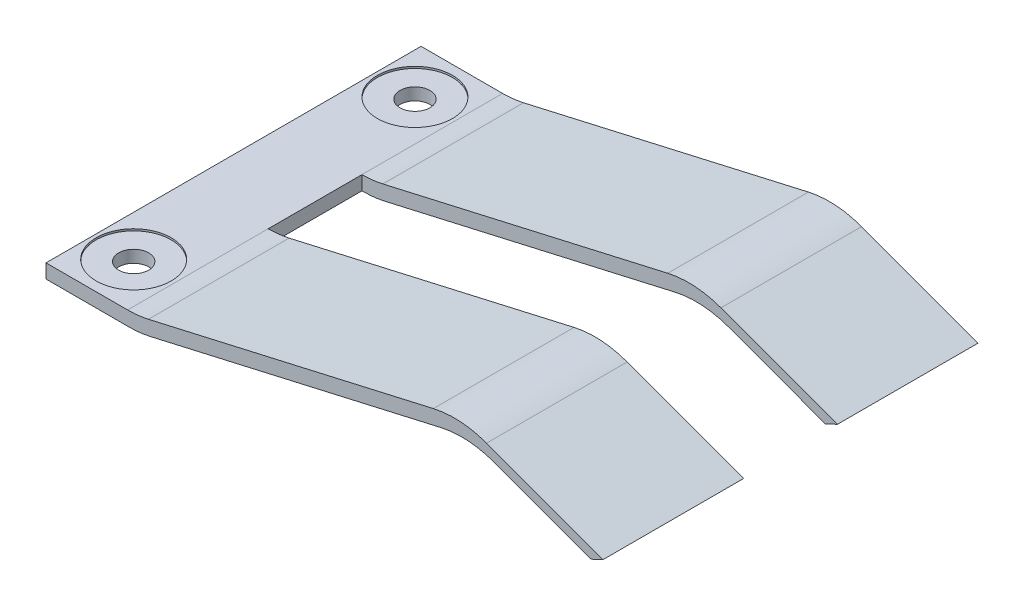
ISO-10303-21;
HEADER;
FILE_DESCRIPTION(('STEP AP214'),'2;1');
FILE_NAME('part.step','',(''),(''),'','','');
FILE_SCHEMA(('AUTOMOTIVE_DESIGN { 1 0 10303 214 1 1 1 1 }'));
ENDSEC;
DATA;
#1=APPLICATION_CONTEXT('core data for automotive mechanical design processes');
#2=APPLICATION_PROTOCOL_DEFINITION('international standard','automotive_design',2000,#1);
#3=PRODUCT_CONTEXT('',#1,'mechanical');
#4=PRODUCT('Part','Part','',(#3));
#5=PRODUCT_RELATED_PRODUCT_CATEGORY('part','',(#4));
#6=PRODUCT_DEFINITION_FORMATION('','',#4);
#7=PRODUCT_DEFINITION_CONTEXT('part definition',#1,'design');
#8=PRODUCT_DEFINITION('design','',#6,#7);
#9=PRODUCT_DEFINITION_SHAPE('','',#8);
#10=(LENGTH_UNIT() NAMED_UNIT(*) SI_UNIT(.MILLI.,.METRE.));
#11=(NAMED_UNIT(*) PLANE_ANGLE_UNIT() SI_UNIT($,.RADIAN.));
#12=(NAMED_UNIT(*) SI_UNIT($,.STERADIAN.) SOLID_ANGLE_UNIT());
#13=UNCERTAINTY_MEASURE_WITH_UNIT(LENGTH_MEASURE(1.E-05),#10,'distance_accuracy_value','');
#14=(GEOMETRIC_REPRESENTATION_CONTEXT(3) GLOBAL_UNCERTAINTY_ASSIGNED_CONTEXT((#13)) GLOBAL_UNIT_ASSIGNED_CONTEXT((#10,
#11,#12)) REPRESENTATION_CONTEXT('',''));
#15=CARTESIAN_POINT('',(0.,0.,0.));
#16=DIRECTION('',(0.,0.,1.));
#17=DIRECTION('',(1.,0.,0.));
#18=AXIS2_PLACEMENT_3D('',#15,#16,#17);
#19=CARTESIAN_POINT('',(0.,0.,40.));
#20=DIRECTION('',(0.,1.,0.));
#21=DIRECTION('',(0.,0.,1.));
#22=AXIS2_PLACEMENT_3D('',#19,#20,#21);
#23=PLANE('',#22);
#24=CARTESIAN_POINT('',(4.35122308541415,0.,35.));
#25=DIRECTION('',(0.,1.,0.));
#26=DIRECTION('',(0.,0.,1.));
#27=AXIS2_PLACEMENT_3D('',#24,#25,#26);
#28=CIRCLE('',#27,1.6);
#29=CARTESIAN_POINT('',(4.35122308541415,0.,36.6));
#30=VERTEX_POINT('',#29);
#31=EDGE_CURVE('E263',#30,#30,#28,.F.);
#32=ORIENTED_EDGE('',*,*,#31,.F.);
#33=EDGE_LOOP('',(#32));
#34=FACE_BOUND('',#33,.T.);
#35=CARTESIAN_POINT('',(4.35122308541415,0.,5.));
#36=DIRECTION('',(0.,1.,0.));
#37=DIRECTION('',(0.,0.,1.));
#38=AXIS2_PLACEMENT_3D('',#35,#36,#37);
#39=CIRCLE('',#38,1.6);
#40=CARTESIAN_POINT('',(4.35122308541415,0.,6.6));
#41=VERTEX_POINT('',#40);
#42=EDGE_CURVE('E281',#41,#41,#39,.F.);
#43=ORIENTED_EDGE('',*,*,#42,.F.);
#44=EDGE_LOOP('',(#43));
#45=FACE_BOUND('',#44,.T.);
#46=DIRECTION('',(1.,0.,0.));
#47=VECTOR('',#46,1.);
#48=CARTESIAN_POINT('',(59.4053783332718,0.,15.));
#49=LINE('',#48,#47);
#50=CARTESIAN_POINT('',(8.7024461708283,0.,15.));
#51=VERTEX_POINT('',#50);
#52=CARTESIAN_POINT('',(8.8716923224594,0.,15.));
#53=VERTEX_POINT('',#52);
#54=EDGE_CURVE('E395',#51,#53,#49,.T.);
#55=ORIENTED_EDGE('',*,*,#54,.F.);
#56=DIRECTION('',(0.,0.,-1.));
#57=VECTOR('',#56,1.);
#58=CARTESIAN_POINT('',(8.7024461708283,0.,15.));
#59=LINE('',#58,#57);
#60=CARTESIAN_POINT('',(8.7024461708283,0.,25.));
#61=VERTEX_POINT('',#60);
#62=EDGE_CURVE('E219',#61,#51,#59,.T.);
#63=ORIENTED_EDGE('',*,*,#62,.F.);
#64=DIRECTION('',(-1.,0.,0.));
#65=VECTOR('',#64,1.);
#66=CARTESIAN_POINT('',(59.4053783332718,0.,25.));
#67=LINE('',#66,#65);
#68=CARTESIAN_POINT('',(8.8716923224594,0.,25.));
#69=VERTEX_POINT('',#68);
#70=EDGE_CURVE('E403',#69,#61,#67,.T.);
#71=ORIENTED_EDGE('',*,*,#70,.F.);
#72=DIRECTION('',(0.,0.,-1.));
#73=VECTOR('',#72,1.);
#74=CARTESIAN_POINT('',(8.8716923224594,0.,40.));
#75=LINE('',#74,#73);
#76=CARTESIAN_POINT('',(8.8716923224594,0.,40.));
#77=VERTEX_POINT('',#76);
#78=EDGE_CURVE('E218',#69,#77,#75,.F.);
#79=ORIENTED_EDGE('',*,*,#78,.T.);
#80=DIRECTION('',(1.,0.,0.));
#81=VECTOR('',#80,1.);
#82=CARTESIAN_POINT('',(0.,0.,40.));
#83=LINE('',#82,#81);
#84=CARTESIAN_POINT('',(0.,0.,40.));
#85=VERTEX_POINT('',#84);
#86=EDGE_CURVE('E290',#85,#77,#83,.T.);
#87=ORIENTED_EDGE('',*,*,#86,.F.);
#88=DIRECTION('',(0.,0.,-1.));
#89=VECTOR('',#88,1.);
#90=CARTESIAN_POINT('',(0.,0.,40.));
#91=LINE('',#90,#89);
#92=CARTESIAN_POINT('',(0.,0.,0.));
#93=VERTEX_POINT('',#92);
#94=EDGE_CURVE('E326',#85,#93,#91,.T.);
#95=ORIENTED_EDGE('',*,*,#94,.T.);
#96=DIRECTION('',(1.,0.,0.));
#97=VECTOR('',#96,1.);
#98=CARTESIAN_POINT('',(0.,0.,0.));
#99=LINE('',#98,#97);
#100=CARTESIAN_POINT('',(8.8716923224594,0.,0.));
#101=VERTEX_POINT('',#100);
#102=EDGE_CURVE('E309',#93,#101,#99,.T.);
#103=ORIENTED_EDGE('',*,*,#102,.T.);
#104=EDGE_CURVE('E235',#101,#53,#75,.F.);
#105=ORIENTED_EDGE('',*,*,#104,.T.);
#106=EDGE_LOOP('',(#55,#63,#71,#79,#87,#95,#103,#105));
#107=FACE_BOUND('',#106,.T.);
#108=ADVANCED_FACE('F42',(#34,#45,#107),#23,.F.);
#109=CARTESIAN_POINT('',(10.,0.,40.));
#110=DIRECTION('',(-0.222824801502141,0.974858506571867,0.));
#111=DIRECTION('',(-0.974858506571867,-0.222824801502141,0.));
#112=AXIS2_PLACEMENT_3D('',#109,#110,#111);
#113=PLANE('',#112);
#114=DIRECTION('',(-0.974858506571867,-0.222824801502141,0.));
#115=VECTOR('',#114,1.);
#116=CARTESIAN_POINT('',(58.8962758151339,11.1762916148877,15.));
#117=LINE('',#116,#115);
#118=CARTESIAN_POINT('',(42.1112913874433,7.33972374570132,15.));
#119=VERTEX_POINT('',#118);
#120=CARTESIAN_POINT('',(11.0999403374808,0.251414934281328,15.));
#121=VERTEX_POINT('',#120);
#122=EDGE_CURVE('E209',#119,#121,#117,.T.);
#123=ORIENTED_EDGE('',*,*,#122,.T.);
#124=DIRECTION('',(0.,0.,-1.));
#125=VECTOR('',#124,1.);
#126=CARTESIAN_POINT('',(11.0999403374808,0.251414934281328,40.));
#127=LINE('',#126,#125);
#128=CARTESIAN_POINT('',(11.0999403374808,0.251414934281327,0.));
#129=VERTEX_POINT('',#128);
#130=EDGE_CURVE('E226',#121,#129,#127,.T.);
#131=ORIENTED_EDGE('',*,*,#130,.T.);
#132=DIRECTION('',(0.974858506571867,0.222824801502141,0.));
#133=VECTOR('',#132,1.);
#134=CARTESIAN_POINT('',(10.,0.,0.));
#135=LINE('',#134,#133);
#136=CARTESIAN_POINT('',(42.1112913874433,7.33972374570132,0.));
#137=VERTEX_POINT('',#136);
#138=EDGE_CURVE('E312',#129,#137,#135,.T.);
#139=ORIENTED_EDGE('',*,*,#138,.T.);
#140=DIRECTION('',(0.,0.,-1.));
#141=VECTOR('',#140,1.);
#142=CARTESIAN_POINT('',(42.1112913874433,7.33972374570132,40.));
#143=LINE('',#142,#141);
#144=EDGE_CURVE('E228',#137,#119,#143,.F.);
#145=ORIENTED_EDGE('',*,*,#144,.T.);
#146=EDGE_LOOP('',(#123,#131,#139,#145));
#147=FACE_BOUND('',#146,.T.);
#148=ADVANCED_FACE('F424',(#147),#113,.F.);
#149=DIRECTION('',(0.974858506571867,0.222824801502141,0.));
#150=VECTOR('',#149,1.);
#151=CARTESIAN_POINT('',(58.8962758151339,11.1762916148877,25.));
#152=LINE('',#151,#150);
#153=CARTESIAN_POINT('',(11.0999403374808,0.251414934281328,25.));
#154=VERTEX_POINT('',#153);
#155=CARTESIAN_POINT('',(42.1112913874433,7.33972374570132,25.));
#156=VERTEX_POINT('',#155);
#157=EDGE_CURVE('E199',#154,#156,#152,.T.);
#158=ORIENTED_EDGE('',*,*,#157,.T.);
#159=CARTESIAN_POINT('',(42.1112913874433,7.33972374570132,40.));
#160=VERTEX_POINT('',#159);
#161=EDGE_CURVE('E225',#156,#160,#143,.F.);
#162=ORIENTED_EDGE('',*,*,#161,.T.);
#163=DIRECTION('',(0.974858506571867,0.222824801502141,0.));
#164=VECTOR('',#163,1.);
#165=CARTESIAN_POINT('',(10.,0.,40.));
#166=LINE('',#165,#164);
#167=CARTESIAN_POINT('',(11.0999403374808,0.251414934281327,40.));
#168=VERTEX_POINT('',#167);
#169=EDGE_CURVE('E224',#168,#160,#166,.T.);
#170=ORIENTED_EDGE('',*,*,#169,.F.);
#171=EDGE_CURVE('E217',#168,#154,#127,.T.);
#172=ORIENTED_EDGE('',*,*,#171,.T.);
#173=EDGE_LOOP('',(#158,#162,#170,#172));
#174=FACE_BOUND('',#173,.T.);
#175=ADVANCED_FACE('F222',(#174),#113,.F.);
#176=CARTESIAN_POINT('',(45.,8.,40.));
#177=DIRECTION('',(0.344254649158423,0.938876315886609,0.));
#178=DIRECTION('',(-0.938876315886609,0.344254649158423,0.));
#179=AXIS2_PLACEMENT_3D('',#176,#177,#178);
#180=PLANE('',#179);
#181=DIRECTION('',(-0.938876315886609,0.344254649158423,0.));
#182=VECTOR('',#181,1.);
#183=CARTESIAN_POINT('',(57.3914603600326,3.4564645346547,15.));
#184=LINE('',#183,#182);
#185=CARTESIAN_POINT('',(58.1222473682268,3.18850929831685,15.));
#186=VERTEX_POINT('',#185);
#187=CARTESIAN_POINT('',(47.7820858940489,6.97990183884873,15.));
#188=VERTEX_POINT('',#187);
#189=EDGE_CURVE('E373',#186,#188,#184,.T.);
#190=ORIENTED_EDGE('',*,*,#189,.T.);
#191=DIRECTION('',(0.,0.,-1.));
#192=VECTOR('',#191,1.);
#193=CARTESIAN_POINT('',(47.7820858940489,6.97990183884873,0.));
#194=LINE('',#193,#192);
#195=CARTESIAN_POINT('',(47.7820858940489,6.97990183884873,0.));
#196=VERTEX_POINT('',#195);
#197=EDGE_CURVE('E348',#188,#196,#194,.T.);
#198=ORIENTED_EDGE('',*,*,#197,.T.);
#199=DIRECTION('',(0.938876315886608,-0.344254649158423,0.));
#200=VECTOR('',#199,1.);
#201=CARTESIAN_POINT('',(45.,8.,0.));
#202=LINE('',#201,#200);
#203=CARTESIAN_POINT('',(58.1222473682268,3.18850929831685,0.));
#204=VERTEX_POINT('',#203);
#205=EDGE_CURVE('E315',#196,#204,#202,.T.);
#206=ORIENTED_EDGE('',*,*,#205,.T.);
#207=DIRECTION('',(0.,0.,1.));
#208=VECTOR('',#207,1.);
#209=CARTESIAN_POINT('',(58.1222473682268,3.18850929831685,40.));
#210=LINE('',#209,#208);
#211=EDGE_CURVE('E52',#204,#186,#210,.T.);
#212=ORIENTED_EDGE('',*,*,#211,.T.);
#213=EDGE_LOOP('',(#190,#198,#206,#212));
#214=FACE_BOUND('',#213,.T.);
#215=ADVANCED_FACE('F430',(#214),#180,.F.);
#216=DIRECTION('',(0.938876315886609,-0.344254649158423,0.));
#217=VECTOR('',#216,1.);
#218=CARTESIAN_POINT('',(57.3914603600326,3.4564645346547,25.));
#219=LINE('',#218,#217);
#220=CARTESIAN_POINT('',(47.7820858940489,6.97990183884873,25.));
#221=VERTEX_POINT('',#220);
#222=CARTESIAN_POINT('',(58.1222473682268,3.18850929831685,25.));
#223=VERTEX_POINT('',#222);
#224=EDGE_CURVE('E359',#221,#223,#219,.T.);
#225=ORIENTED_EDGE('',*,*,#224,.T.);
#226=CARTESIAN_POINT('',(58.1222473682268,3.18850929831685,40.));
#227=VERTEX_POINT('',#226);
#228=EDGE_CURVE('E68',#223,#227,#210,.T.);
#229=ORIENTED_EDGE('',*,*,#228,.T.);
#230=DIRECTION('',(0.938876315886608,-0.344254649158423,0.));
#231=VECTOR('',#230,1.);
#232=CARTESIAN_POINT('',(45.,8.,40.));
#233=LINE('',#232,#231);
#234=CARTESIAN_POINT('',(47.7820858940489,6.97990183884873,40.));
#235=VERTEX_POINT('',#234);
#236=EDGE_CURVE('E295',#235,#227,#233,.T.);
#237=ORIENTED_EDGE('',*,*,#236,.F.);
#238=EDGE_CURVE('E230',#235,#221,#194,.T.);
#239=ORIENTED_EDGE('',*,*,#238,.T.);
#240=EDGE_LOOP('',(#225,#229,#237,#239));
#241=FACE_BOUND('',#240,.T.);
#242=ADVANCED_FACE('F358',(#241),#180,.F.);
#243=CARTESIAN_POINT('',(44.2043825523448,9.35682941805162,40.));
#244=DIRECTION('',(-0.344254649158423,-0.938876315886609,0.));
#245=DIRECTION('',(0.938876315886609,-0.344254649158423,0.));
#246=AXIS2_PLACEMENT_3D('',#243,#244,#245);
#247=PLANE('',#246);
#248=DIRECTION('',(0.938876315886609,-0.344254649158423,0.));
#249=VECTOR('',#248,1.);
#250=CARTESIAN_POINT('',(57.7357150091911,4.39534085054131,15.));
#251=LINE('',#250,#249);
#252=CARTESIAN_POINT('',(46.9864684463937,8.33673125690035,15.));
#253=VERTEX_POINT('',#252);
#254=CARTESIAN_POINT('',(59.4053783332718,3.78313096504505,15.));
#255=VERTEX_POINT('',#254);
#256=EDGE_CURVE('E375',#253,#255,#251,.T.);
#257=ORIENTED_EDGE('',*,*,#256,.T.);
#258=DIRECTION('',(0.,0.,1.));
#259=VECTOR('',#258,1.);
#260=CARTESIAN_POINT('',(59.4053783332718,3.78313096504504,40.));
#261=LINE('',#260,#259);
#262=CARTESIAN_POINT('',(59.4053783332718,3.78313096504504,0.));
#263=VERTEX_POINT('',#262);
#264=EDGE_CURVE('E250',#255,#263,#261,.F.);
#265=ORIENTED_EDGE('',*,*,#264,.T.);
#266=DIRECTION('',(-0.938876315886609,0.344254649158423,0.));
#267=VECTOR('',#266,1.);
#268=CARTESIAN_POINT('',(44.2043825523448,9.35682941805162,0.));
#269=LINE('',#268,#267);
#270=CARTESIAN_POINT('',(46.9864684463937,8.33673125690035,0.));
#271=VERTEX_POINT('',#270);
#272=EDGE_CURVE('E318',#263,#271,#269,.T.);
#273=ORIENTED_EDGE('',*,*,#272,.T.);
#274=DIRECTION('',(0.,0.,-1.));
#275=VECTOR('',#274,1.);
#276=CARTESIAN_POINT('',(46.9864684463937,8.33673125690035,40.));
#277=LINE('',#276,#275);
#278=EDGE_CURVE('E343',#271,#253,#277,.F.);
#279=ORIENTED_EDGE('',*,*,#278,.T.);
#280=EDGE_LOOP('',(#257,#265,#273,#279));
#281=FACE_BOUND('',#280,.T.);
#282=ADVANCED_FACE('F437',(#281),#247,.F.);
#283=DIRECTION('',(-0.938876315886609,0.344254649158423,0.));
#284=VECTOR('',#283,1.);
#285=CARTESIAN_POINT('',(57.7357150091911,4.39534085054131,25.));
#286=LINE('',#285,#284);
#287=CARTESIAN_POINT('',(59.4053783332718,3.78313096504504,25.));
#288=VERTEX_POINT('',#287);
#289=CARTESIAN_POINT('',(46.9864684463937,8.33673125690035,25.));
#290=VERTEX_POINT('',#289);
#291=EDGE_CURVE('E60',#288,#290,#286,.T.);
#292=ORIENTED_EDGE('',*,*,#291,.T.);
#293=CARTESIAN_POINT('',(46.9864684463937,8.33673125690035,40.));
#294=VERTEX_POINT('',#293);
#295=EDGE_CURVE('E342',#290,#294,#277,.F.);
#296=ORIENTED_EDGE('',*,*,#295,.T.);
#297=DIRECTION('',(-0.938876315886609,0.344254649158423,0.));
#298=VECTOR('',#297,1.);
#299=CARTESIAN_POINT('',(44.2043825523448,9.35682941805162,40.));
#300=LINE('',#299,#298);
#301=CARTESIAN_POINT('',(59.4053783332718,3.78313096504504,40.));
#302=VERTEX_POINT('',#301);
#303=EDGE_CURVE('E298',#302,#294,#300,.T.);
#304=ORIENTED_EDGE('',*,*,#303,.F.);
#305=EDGE_CURVE('E251',#302,#288,#261,.F.);
#306=ORIENTED_EDGE('',*,*,#305,.T.);
#307=EDGE_LOOP('',(#292,#296,#304,#306));
#308=FACE_BOUND('',#307,.T.);
#309=ADVANCED_FACE('F470',(#308),#247,.F.);
#310=CARTESIAN_POINT('',(9.83075384836891,1.5,40.));
#311=DIRECTION('',(0.222824801502141,-0.974858506571867,0.));
#312=DIRECTION('',(0.974858506571867,0.222824801502141,0.));
#313=AXIS2_PLACEMENT_3D('',#310,#311,#312);
#314=PLANE('',#313);
#315=DIRECTION('',(0.974858506571867,0.222824801502141,0.));
#316=VECTOR('',#315,1.);
#317=CARTESIAN_POINT('',(58.5620386128807,12.6385793747455,15.));
#318=LINE('',#317,#316);
#319=CARTESIAN_POINT('',(10.9306941858497,1.75141493428133,15.));
#320=VERTEX_POINT('',#319);
#321=CARTESIAN_POINT('',(41.315673939788,8.69655316375294,15.));
#322=VERTEX_POINT('',#321);
#323=EDGE_CURVE('E378',#320,#322,#318,.T.);
#324=ORIENTED_EDGE('',*,*,#323,.T.);
#325=DIRECTION('',(0.,0.,-1.));
#326=VECTOR('',#325,1.);
#327=CARTESIAN_POINT('',(41.315673939788,8.69655316375295,40.));
#328=LINE('',#327,#326);
#329=CARTESIAN_POINT('',(41.315673939788,8.69655316375295,0.));
#330=VERTEX_POINT('',#329);
#331=EDGE_CURVE('E333',#322,#330,#328,.T.);
#332=ORIENTED_EDGE('',*,*,#331,.T.);
#333=DIRECTION('',(-0.974858506571867,-0.222824801502141,0.));
#334=VECTOR('',#333,1.);
#335=CARTESIAN_POINT('',(9.83075384836891,1.5,0.));
#336=LINE('',#335,#334);
#337=CARTESIAN_POINT('',(10.9306941858497,1.75141493428133,0.));
#338=VERTEX_POINT('',#337);
#339=EDGE_CURVE('E320',#330,#338,#336,.T.);
#340=ORIENTED_EDGE('',*,*,#339,.T.);
#341=DIRECTION('',(0.,0.,-1.));
#342=VECTOR('',#341,1.);
#343=CARTESIAN_POINT('',(10.9306941858497,1.75141493428133,40.));
#344=LINE('',#343,#342);
#345=EDGE_CURVE('E330',#338,#320,#344,.F.);
#346=ORIENTED_EDGE('',*,*,#345,.T.);
#347=EDGE_LOOP('',(#324,#332,#340,#346));
#348=FACE_BOUND('',#347,.T.);
#349=ADVANCED_FACE('F446',(#348),#314,.F.);
#350=DIRECTION('',(-0.974858506571867,-0.222824801502141,0.));
#351=VECTOR('',#350,1.);
#352=CARTESIAN_POINT('',(58.5620386128807,12.6385793747455,25.));
#353=LINE('',#352,#351);
#354=CARTESIAN_POINT('',(41.315673939788,8.69655316375294,25.));
#355=VERTEX_POINT('',#354);
#356=CARTESIAN_POINT('',(10.9306941858497,1.75141493428133,25.));
#357=VERTEX_POINT('',#356);
#358=EDGE_CURVE('E273',#355,#357,#353,.T.);
#359=ORIENTED_EDGE('',*,*,#358,.T.);
#360=CARTESIAN_POINT('',(10.9306941858497,1.75141493428133,40.));
#361=VERTEX_POINT('',#360);
#362=EDGE_CURVE('E329',#357,#361,#344,.F.);
#363=ORIENTED_EDGE('',*,*,#362,.T.);
#364=DIRECTION('',(-0.974858506571867,-0.222824801502141,0.));
#365=VECTOR('',#364,1.);
#366=CARTESIAN_POINT('',(9.83075384836891,1.5,40.));
#367=LINE('',#366,#365);
#368=CARTESIAN_POINT('',(41.315673939788,8.69655316375295,40.));
#369=VERTEX_POINT('',#368);
#370=EDGE_CURVE('E301',#369,#361,#367,.T.);
#371=ORIENTED_EDGE('',*,*,#370,.F.);
#372=EDGE_CURVE('E334',#369,#355,#328,.T.);
#373=ORIENTED_EDGE('',*,*,#372,.T.);
#374=EDGE_LOOP('',(#359,#363,#371,#373));
#375=FACE_BOUND('',#374,.T.);
#376=ADVANCED_FACE('F464',(#375),#314,.F.);
#377=CARTESIAN_POINT('',(43.5439219548095,-1.05203190196573,40.));
#378=DIRECTION('',(0.,0.,-1.));
#379=DIRECTION('',(-1.,0.,0.));
#380=AXIS2_PLACEMENT_3D('',#377,#378,#379);
#381=CYLINDRICAL_SURFACE('',#380,10.);
#382=ORIENTED_EDGE('',*,*,#331,.F.);
#383=CARTESIAN_POINT('',(43.5439219548095,-1.05203190196573,15.));
#384=DIRECTION('',(0.,0.,1.));
#385=DIRECTION('',(1.,0.,0.));
#386=AXIS2_PLACEMENT_3D('',#383,#384,#385);
#387=CIRCLE('',#386,10.);
#388=EDGE_CURVE('E381',#253,#322,#387,.T.);
#389=ORIENTED_EDGE('',*,*,#388,.F.);
#390=ORIENTED_EDGE('',*,*,#278,.F.);
#391=CARTESIAN_POINT('',(43.5439219548095,-1.05203190196573,0.));
#392=DIRECTION('',(0.,0.,-1.));
#393=DIRECTION('',(-1.,0.,0.));
#394=AXIS2_PLACEMENT_3D('',#391,#392,#393);
#395=CIRCLE('',#394,10.);
#396=EDGE_CURVE('E339',#330,#271,#395,.T.);
#397=ORIENTED_EDGE('',*,*,#396,.F.);
#398=EDGE_LOOP('',(#382,#389,#390,#397));
#399=FACE_BOUND('',#398,.T.);
#400=ADVANCED_FACE('F443',(#399),#381,.T.);
#401=ORIENTED_EDGE('',*,*,#295,.F.);
#402=CARTESIAN_POINT('',(43.5439219548095,-1.05203190196573,25.));
#403=DIRECTION('',(0.,0.,-1.));
#404=DIRECTION('',(-1.,0.,0.));
#405=AXIS2_PLACEMENT_3D('',#402,#403,#404);
#406=CIRCLE('',#405,10.);
#407=EDGE_CURVE('E363',#355,#290,#406,.T.);
#408=ORIENTED_EDGE('',*,*,#407,.F.);
#409=ORIENTED_EDGE('',*,*,#372,.F.);
#410=CARTESIAN_POINT('',(43.5439219548095,-1.05203190196573,40.));
#411=DIRECTION('',(0.,0.,-1.));
#412=DIRECTION('',(-1.,0.,0.));
#413=AXIS2_PLACEMENT_3D('',#410,#411,#412);
#414=CIRCLE('',#413,10.);
#415=EDGE_CURVE('E347',#294,#369,#414,.F.);
#416=ORIENTED_EDGE('',*,*,#415,.F.);
#417=EDGE_LOOP('',(#401,#408,#409,#416));
#418=FACE_BOUND('',#417,.T.);
#419=ADVANCED_FACE('F468',(#418),#381,.T.);
#420=CARTESIAN_POINT('',(44.3395394024647,-2.40886132001735,40.));
#421=DIRECTION('',(0.,0.,1.));
#422=DIRECTION('',(1.,0.,0.));
#423=AXIS2_PLACEMENT_3D('',#420,#421,#422);
#424=CYLINDRICAL_SURFACE('',#423,10.);
#425=CARTESIAN_POINT('',(44.3395394024647,-2.40886132001735,15.));
#426=DIRECTION('',(0.,0.,1.));
#427=DIRECTION('',(1.,0.,0.));
#428=AXIS2_PLACEMENT_3D('',#425,#426,#427);
#429=CIRCLE('',#428,10.);
#430=EDGE_CURVE('E383',#188,#119,#429,.T.);
#431=ORIENTED_EDGE('',*,*,#430,.T.);
#432=ORIENTED_EDGE('',*,*,#144,.F.);
#433=CARTESIAN_POINT('',(44.3395394024647,-2.40886132001735,0.));
#434=DIRECTION('',(0.,0.,-1.));
#435=DIRECTION('',(-1.,0.,0.));
#436=AXIS2_PLACEMENT_3D('',#433,#434,#435);
#437=CIRCLE('',#436,10.);
#438=EDGE_CURVE('E242',#196,#137,#437,.F.);
#439=ORIENTED_EDGE('',*,*,#438,.F.);
#440=ORIENTED_EDGE('',*,*,#197,.F.);
#441=EDGE_LOOP('',(#431,#432,#439,#440));
#442=FACE_BOUND('',#441,.T.);
#443=ADVANCED_FACE('F427',(#442),#424,.F.);
#444=CARTESIAN_POINT('',(44.3395394024647,-2.40886132001735,25.));
#445=DIRECTION('',(0.,0.,-1.));
#446=DIRECTION('',(-1.,0.,0.));
#447=AXIS2_PLACEMENT_3D('',#444,#445,#446);
#448=CIRCLE('',#447,10.);
#449=EDGE_CURVE('E205',#156,#221,#448,.T.);
#450=ORIENTED_EDGE('',*,*,#449,.T.);
#451=ORIENTED_EDGE('',*,*,#238,.F.);
#452=CARTESIAN_POINT('',(44.3395394024647,-2.40886132001735,40.));
#453=DIRECTION('',(0.,0.,-1.));
#454=DIRECTION('',(-1.,0.,0.));
#455=AXIS2_PLACEMENT_3D('',#452,#453,#454);
#456=CIRCLE('',#455,10.);
#457=EDGE_CURVE('E244',#160,#235,#456,.T.);
#458=ORIENTED_EDGE('',*,*,#457,.F.);
#459=ORIENTED_EDGE('',*,*,#161,.F.);
#460=EDGE_LOOP('',(#450,#451,#458,#459));
#461=FACE_BOUND('',#460,.T.);
#462=ADVANCED_FACE('F362',(#461),#424,.F.);
#463=CARTESIAN_POINT('',(8.8716923224594,10.,40.));
#464=DIRECTION('',(0.,0.,-1.));
#465=DIRECTION('',(-1.,0.,0.));
#466=AXIS2_PLACEMENT_3D('',#463,#464,#465);
#467=CYLINDRICAL_SURFACE('',#466,10.);
#468=ORIENTED_EDGE('',*,*,#130,.F.);
#469=CARTESIAN_POINT('',(8.8716923224594,10.,15.));
#470=DIRECTION('',(0.,0.,-1.));
#471=DIRECTION('',(-1.,0.,0.));
#472=AXIS2_PLACEMENT_3D('',#469,#470,#471);
#473=CIRCLE('',#472,10.);
#474=EDGE_CURVE('E397',#121,#53,#473,.T.);
#475=ORIENTED_EDGE('',*,*,#474,.T.);
#476=ORIENTED_EDGE('',*,*,#104,.F.);
#477=CARTESIAN_POINT('',(8.8716923224594,10.,0.));
#478=DIRECTION('',(0.,0.,-1.));
#479=DIRECTION('',(-1.,0.,0.));
#480=AXIS2_PLACEMENT_3D('',#477,#478,#479);
#481=CIRCLE('',#480,10.);
#482=EDGE_CURVE('E337',#129,#101,#481,.T.);
#483=ORIENTED_EDGE('',*,*,#482,.F.);
#484=EDGE_LOOP('',(#468,#475,#476,#483));
#485=FACE_BOUND('',#484,.T.);
#486=ADVANCED_FACE('F421',(#485),#467,.T.);
#487=ORIENTED_EDGE('',*,*,#78,.F.);
#488=CARTESIAN_POINT('',(8.8716923224594,10.,25.));
#489=DIRECTION('',(0.,0.,1.));
#490=DIRECTION('',(1.,0.,0.));
#491=AXIS2_PLACEMENT_3D('',#488,#489,#490);
#492=CIRCLE('',#491,10.);
#493=EDGE_CURVE('E202',#69,#154,#492,.T.);
#494=ORIENTED_EDGE('',*,*,#493,.T.);
#495=ORIENTED_EDGE('',*,*,#171,.F.);
#496=CARTESIAN_POINT('',(8.8716923224594,10.,40.));
#497=DIRECTION('',(0.,0.,-1.));
#498=DIRECTION('',(-1.,0.,0.));
#499=AXIS2_PLACEMENT_3D('',#496,#497,#498);
#500=CIRCLE('',#499,10.);
#501=EDGE_CURVE('E346',#77,#168,#500,.F.);
#502=ORIENTED_EDGE('',*,*,#501,.F.);
#503=EDGE_LOOP('',(#487,#494,#495,#502));
#504=FACE_BOUND('',#503,.T.);
#505=ADVANCED_FACE('F215',(#504),#467,.T.);
#506=CARTESIAN_POINT('',(8.7024461708283,11.5,40.));
#507=DIRECTION('',(0.,0.,1.));
#508=DIRECTION('',(1.,0.,0.));
#509=AXIS2_PLACEMENT_3D('',#506,#507,#508);
#510=CYLINDRICAL_SURFACE('',#509,10.);
#511=CARTESIAN_POINT('',(8.7024461708283,11.5,15.));
#512=DIRECTION('',(0.,0.,1.));
#513=DIRECTION('',(1.,0.,0.));
#514=AXIS2_PLACEMENT_3D('',#511,#512,#513);
#515=CIRCLE('',#514,10.);
#516=CARTESIAN_POINT('',(8.7024461708283,1.5,15.));
#517=VERTEX_POINT('',#516);
#518=EDGE_CURVE('E210',#517,#320,#515,.T.);
#519=ORIENTED_EDGE('',*,*,#518,.T.);
#520=ORIENTED_EDGE('',*,*,#345,.F.);
#521=CARTESIAN_POINT('',(8.7024461708283,11.5,0.));
#522=DIRECTION('',(0.,0.,-1.));
#523=DIRECTION('',(-1.,0.,0.));
#524=AXIS2_PLACEMENT_3D('',#521,#522,#523);
#525=CIRCLE('',#524,10.);
#526=CARTESIAN_POINT('',(8.7024461708283,1.5,0.));
#527=VERTEX_POINT('',#526);
#528=EDGE_CURVE('E246',#527,#338,#525,.F.);
#529=ORIENTED_EDGE('',*,*,#528,.F.);
#530=DIRECTION('',(0.,0.,-1.));
#531=VECTOR('',#530,1.);
#532=CARTESIAN_POINT('',(8.7024461708283,1.5,0.));
#533=LINE('',#532,#531);
#534=EDGE_CURVE('E238',#517,#527,#533,.T.);
#535=ORIENTED_EDGE('',*,*,#534,.F.);
#536=EDGE_LOOP('',(#519,#520,#529,#535));
#537=FACE_BOUND('',#536,.T.);
#538=ADVANCED_FACE('F450',(#537),#510,.F.);
#539=CARTESIAN_POINT('',(8.7024461708283,11.5,25.));
#540=DIRECTION('',(0.,0.,-1.));
#541=DIRECTION('',(-1.,0.,0.));
#542=AXIS2_PLACEMENT_3D('',#539,#540,#541);
#543=CIRCLE('',#542,10.);
#544=CARTESIAN_POINT('',(8.7024461708283,1.5,25.));
#545=VERTEX_POINT('',#544);
#546=EDGE_CURVE('E392',#357,#545,#543,.T.);
#547=ORIENTED_EDGE('',*,*,#546,.T.);
#548=CARTESIAN_POINT('',(8.7024461708283,1.5,40.));
#549=VERTEX_POINT('',#548);
#550=EDGE_CURVE('E239',#549,#545,#533,.T.);
#551=ORIENTED_EDGE('',*,*,#550,.F.);
#552=CARTESIAN_POINT('',(8.7024461708283,11.5,40.));
#553=DIRECTION('',(0.,0.,-1.));
#554=DIRECTION('',(-1.,0.,0.));
#555=AXIS2_PLACEMENT_3D('',#552,#553,#554);
#556=CIRCLE('',#555,10.);
#557=EDGE_CURVE('E248',#361,#549,#556,.T.);
#558=ORIENTED_EDGE('',*,*,#557,.F.);
#559=ORIENTED_EDGE('',*,*,#362,.F.);
#560=EDGE_LOOP('',(#547,#551,#558,#559));
#561=FACE_BOUND('',#560,.T.);
#562=ADVANCED_FACE('F459',(#561),#510,.F.);
#563=CARTESIAN_POINT('',(60.,4.05868734718738,40.));
#564=DIRECTION('',(-0.420461012783953,0.907310606533778,0.));
#565=DIRECTION('',(0.,0.,-1.));
#566=AXIS2_PLACEMENT_3D('',#563,#564,#565);
#567=PLANE('',#566);
#568=ORIENTED_EDGE('',*,*,#264,.F.);
#569=DIRECTION('',(-0.907310606533778,-0.420461012783953,0.));
#570=VECTOR('',#569,1.);
#571=CARTESIAN_POINT('',(61.3760870142702,4.69638620745893,15.));
#572=LINE('',#571,#570);
#573=EDGE_CURVE('E386',#186,#255,#572,.F.);
#574=ORIENTED_EDGE('',*,*,#573,.F.);
#575=ORIENTED_EDGE('',*,*,#211,.F.);
#576=DIRECTION('',(0.907310606533778,0.420461012783953,0.));
#577=VECTOR('',#576,1.);
#578=CARTESIAN_POINT('',(9.05890428821821,-19.5481618851021,0.));
#579=LINE('',#578,#577);
#580=EDGE_CURVE('E254',#263,#204,#579,.F.);
#581=ORIENTED_EDGE('',*,*,#580,.F.);
#582=EDGE_LOOP('',(#568,#574,#575,#581));
#583=FACE_BOUND('',#582,.T.);
#584=ADVANCED_FACE('F45',(#583),#567,.F.);
#585=ORIENTED_EDGE('',*,*,#228,.F.);
#586=DIRECTION('',(0.907310606533778,0.420461012783953,0.));
#587=VECTOR('',#586,1.);
#588=CARTESIAN_POINT('',(61.3760870142702,4.69638620745893,25.));
#589=LINE('',#588,#587);
#590=EDGE_CURVE('E368',#288,#223,#589,.F.);
#591=ORIENTED_EDGE('',*,*,#590,.F.);
#592=ORIENTED_EDGE('',*,*,#305,.F.);
#593=DIRECTION('',(-0.907310606533778,-0.420461012783953,0.));
#594=VECTOR('',#593,1.);
#595=CARTESIAN_POINT('',(60.,4.05868734718738,40.));
#596=LINE('',#595,#594);
#597=EDGE_CURVE('E11',#227,#302,#596,.F.);
#598=ORIENTED_EDGE('',*,*,#597,.F.);
#599=EDGE_LOOP('',(#585,#591,#592,#598));
#600=FACE_BOUND('',#599,.T.);
#601=ADVANCED_FACE('F474',(#600),#567,.F.);
#602=CARTESIAN_POINT('',(4.35122308541415,-0.000999999999999916,35.));
#603=DIRECTION('',(0.,1.,0.));
#604=DIRECTION('',(0.,0.,1.));
#605=AXIS2_PLACEMENT_3D('',#602,#603,#604);
#606=CYLINDRICAL_SURFACE('',#605,1.6);
#607=ORIENTED_EDGE('',*,*,#31,.T.);
#608=EDGE_LOOP('',(#607));
#609=FACE_BOUND('',#608,.T.);
#610=CARTESIAN_POINT('',(4.35122308541415,1.3,35.));
#611=DIRECTION('',(0.,1.,0.));
#612=DIRECTION('',(0.,0.,1.));
#613=AXIS2_PLACEMENT_3D('',#610,#611,#612);
#614=CIRCLE('',#613,1.6);
#615=CARTESIAN_POINT('',(4.35122308541415,1.3,36.6));
#616=VERTEX_POINT('',#615);
#617=EDGE_CURVE('E47',#616,#616,#614,.F.);
#618=ORIENTED_EDGE('',*,*,#617,.F.);
#619=EDGE_LOOP('',(#618));
#620=FACE_BOUND('',#619,.T.);
#621=ADVANCED_FACE('F640',(#609,#620),#606,.F.);
#622=CARTESIAN_POINT('',(4.35122308541415,-0.000999999999999916,5.));
#623=DIRECTION('',(0.,1.,0.));
#624=DIRECTION('',(0.,0.,1.));
#625=AXIS2_PLACEMENT_3D('',#622,#623,#624);
#626=CYLINDRICAL_SURFACE('',#625,1.6);
#627=ORIENTED_EDGE('',*,*,#42,.T.);
#628=EDGE_LOOP('',(#627));
#629=FACE_BOUND('',#628,.T.);
#630=CARTESIAN_POINT('',(4.35122308541415,1.3,5.));
#631=DIRECTION('',(0.,1.,0.));
#632=DIRECTION('',(0.,0.,1.));
#633=AXIS2_PLACEMENT_3D('',#630,#631,#632);
#634=CIRCLE('',#633,1.6);
#635=CARTESIAN_POINT('',(4.35122308541415,1.3,6.6));
#636=VERTEX_POINT('',#635);
#637=EDGE_CURVE('E257',#636,#636,#634,.F.);
#638=ORIENTED_EDGE('',*,*,#637,.F.);
#639=EDGE_LOOP('',(#638));
#640=FACE_BOUND('',#639,.T.);
#641=ADVANCED_FACE('F508',(#629,#640),#626,.F.);
#642=CARTESIAN_POINT('',(0.,0.,40.));
#643=DIRECTION('',(1.,0.,0.));
#644=DIRECTION('',(0.,0.,-1.));
#645=AXIS2_PLACEMENT_3D('',#642,#643,#644);
#646=PLANE('',#645);
#647=DIRECTION('',(0.,-1.,0.));
#648=VECTOR('',#647,1.);
#649=CARTESIAN_POINT('',(0.,0.,0.));
#650=LINE('',#649,#648);
#651=CARTESIAN_POINT('',(0.,1.5,0.));
#652=VERTEX_POINT('',#651);
#653=EDGE_CURVE('E284',#652,#93,#650,.T.);
#654=ORIENTED_EDGE('',*,*,#653,.T.);
#655=ORIENTED_EDGE('',*,*,#94,.F.);
#656=DIRECTION('',(0.,-1.,0.));
#657=VECTOR('',#656,1.);
#658=CARTESIAN_POINT('',(0.,0.,40.));
#659=LINE('',#658,#657);
#660=CARTESIAN_POINT('',(0.,1.5,40.));
#661=VERTEX_POINT('',#660);
#662=EDGE_CURVE('E287',#661,#85,#659,.T.);
#663=ORIENTED_EDGE('',*,*,#662,.F.);
#664=DIRECTION('',(0.,0.,-1.));
#665=VECTOR('',#664,1.);
#666=CARTESIAN_POINT('',(0.,1.5,40.));
#667=LINE('',#666,#665);
#668=EDGE_CURVE('E306',#661,#652,#667,.T.);
#669=ORIENTED_EDGE('',*,*,#668,.T.);
#670=EDGE_LOOP('',(#654,#655,#663,#669));
#671=FACE_BOUND('',#670,.T.);
#672=ADVANCED_FACE('F480',(#671),#646,.F.);
#673=CARTESIAN_POINT('',(0.,1.5,40.));
#674=DIRECTION('',(0.,-1.,0.));
#675=DIRECTION('',(0.,0.,-1.));
#676=AXIS2_PLACEMENT_3D('',#673,#674,#675);
#677=PLANE('',#676);
#678=CARTESIAN_POINT('',(4.35122308541415,1.5,5.));
#679=DIRECTION('',(0.,1.,0.));
#680=DIRECTION('',(0.,0.,1.));
#681=AXIS2_PLACEMENT_3D('',#678,#679,#680);
#682=CIRCLE('',#681,4.);
#683=CARTESIAN_POINT('',(4.35122308541415,1.5,9.));
#684=VERTEX_POINT('',#683);
#685=EDGE_CURVE('E265',#684,#684,#682,.T.);
#686=ORIENTED_EDGE('',*,*,#685,.F.);
#687=EDGE_LOOP('',(#686));
#688=FACE_BOUND('',#687,.T.);
#689=CARTESIAN_POINT('',(4.35122308541415,1.5,35.));
#690=DIRECTION('',(0.,1.,0.));
#691=DIRECTION('',(0.,0.,1.));
#692=AXIS2_PLACEMENT_3D('',#689,#690,#691);
#693=CIRCLE('',#692,4.);
#694=CARTESIAN_POINT('',(4.35122308541415,1.5,39.));
#695=VERTEX_POINT('',#694);
#696=EDGE_CURVE('E270',#695,#695,#693,.T.);
#697=ORIENTED_EDGE('',*,*,#696,.F.);
#698=EDGE_LOOP('',(#697));
#699=FACE_BOUND('',#698,.T.);
#700=DIRECTION('',(-1.,0.,0.));
#701=VECTOR('',#700,1.);
#702=CARTESIAN_POINT('',(0.,1.5,40.));
#703=LINE('',#702,#701);
#704=EDGE_CURVE('E304',#549,#661,#703,.T.);
#705=ORIENTED_EDGE('',*,*,#704,.F.);
#706=ORIENTED_EDGE('',*,*,#550,.T.);
#707=DIRECTION('',(0.,0.,1.));
#708=VECTOR('',#707,1.);
#709=CARTESIAN_POINT('',(8.7024461708283,1.5,15.));
#710=LINE('',#709,#708);
#711=EDGE_CURVE('E370',#517,#545,#710,.T.);
#712=ORIENTED_EDGE('',*,*,#711,.F.);
#713=ORIENTED_EDGE('',*,*,#534,.T.);
#714=DIRECTION('',(-1.,0.,0.));
#715=VECTOR('',#714,1.);
#716=CARTESIAN_POINT('',(0.,1.5,0.));
#717=LINE('',#716,#715);
#718=EDGE_CURVE('E291',#527,#652,#717,.T.);
#719=ORIENTED_EDGE('',*,*,#718,.T.);
#720=ORIENTED_EDGE('',*,*,#668,.F.);
#721=EDGE_LOOP('',(#705,#706,#712,#713,#719,#720));
#722=FACE_BOUND('',#721,.T.);
#723=ADVANCED_FACE('F455',(#688,#699,#722),#677,.F.);
#724=CARTESIAN_POINT('',(0.,0.,40.));
#725=DIRECTION('',(0.,0.,-1.));
#726=DIRECTION('',(-1.,0.,0.));
#727=AXIS2_PLACEMENT_3D('',#724,#725,#726);
#728=PLANE('',#727);
#729=ORIENTED_EDGE('',*,*,#236,.T.);
#730=ORIENTED_EDGE('',*,*,#597,.T.);
#731=ORIENTED_EDGE('',*,*,#303,.T.);
#732=ORIENTED_EDGE('',*,*,#415,.T.);
#733=ORIENTED_EDGE('',*,*,#370,.T.);
#734=ORIENTED_EDGE('',*,*,#557,.T.);
#735=ORIENTED_EDGE('',*,*,#704,.T.);
#736=ORIENTED_EDGE('',*,*,#662,.T.);
#737=ORIENTED_EDGE('',*,*,#86,.T.);
#738=ORIENTED_EDGE('',*,*,#501,.T.);
#739=ORIENTED_EDGE('',*,*,#169,.T.);
#740=ORIENTED_EDGE('',*,*,#457,.T.);
#741=EDGE_LOOP('',(#729,#730,#731,#732,#733,#734,#735,#736,#737,#738,#739,#740));
#742=FACE_BOUND('',#741,.T.);
#743=ADVANCED_FACE('F475',(#742),#728,.F.);
#744=CARTESIAN_POINT('',(0.,0.,0.));
#745=DIRECTION('',(0.,0.,-1.));
#746=DIRECTION('',(-1.,0.,0.));
#747=AXIS2_PLACEMENT_3D('',#744,#745,#746);
#748=PLANE('',#747);
#749=ORIENTED_EDGE('',*,*,#272,.F.);
#750=ORIENTED_EDGE('',*,*,#580,.T.);
#751=ORIENTED_EDGE('',*,*,#205,.F.);
#752=ORIENTED_EDGE('',*,*,#438,.T.);
#753=ORIENTED_EDGE('',*,*,#138,.F.);
#754=ORIENTED_EDGE('',*,*,#482,.T.);
#755=ORIENTED_EDGE('',*,*,#102,.F.);
#756=ORIENTED_EDGE('',*,*,#653,.F.);
#757=ORIENTED_EDGE('',*,*,#718,.F.);
#758=ORIENTED_EDGE('',*,*,#528,.T.);
#759=ORIENTED_EDGE('',*,*,#339,.F.);
#760=ORIENTED_EDGE('',*,*,#396,.T.);
#761=EDGE_LOOP('',(#749,#750,#751,#752,#753,#754,#755,#756,#757,#758,#759,#760));
#762=FACE_BOUND('',#761,.T.);
#763=ADVANCED_FACE('F483',(#762),#748,.T.);
#764=CARTESIAN_POINT('',(4.35122308541415,1.3,5.));
#765=DIRECTION('',(0.,1.,0.));
#766=DIRECTION('',(0.,0.,1.));
#767=AXIS2_PLACEMENT_3D('',#764,#765,#766);
#768=PLANE('',#767);
#769=CARTESIAN_POINT('',(4.35122308541415,1.3,5.));
#770=DIRECTION('',(0.,1.,0.));
#771=DIRECTION('',(0.,0.,1.));
#772=AXIS2_PLACEMENT_3D('',#769,#770,#771);
#773=CIRCLE('',#772,4.);
#774=CARTESIAN_POINT('',(4.35122308541415,1.3,9.));
#775=VERTEX_POINT('',#774);
#776=EDGE_CURVE('E259',#775,#775,#773,.T.);
#777=ORIENTED_EDGE('',*,*,#776,.T.);
#778=EDGE_LOOP('',(#777));
#779=FACE_BOUND('',#778,.T.);
#780=ORIENTED_EDGE('',*,*,#637,.T.);
#781=EDGE_LOOP('',(#780));
#782=FACE_BOUND('',#781,.T.);
#783=ADVANCED_FACE('F485',(#779,#782),#768,.T.);
#784=CARTESIAN_POINT('',(4.35122308541415,1.3,5.));
#785=DIRECTION('',(0.,1.,0.));
#786=DIRECTION('',(0.,0.,1.));
#787=AXIS2_PLACEMENT_3D('',#784,#785,#786);
#788=CYLINDRICAL_SURFACE('',#787,4.);
#789=ORIENTED_EDGE('',*,*,#776,.F.);
#790=EDGE_LOOP('',(#789));
#791=FACE_BOUND('',#790,.T.);
#792=ORIENTED_EDGE('',*,*,#685,.T.);
#793=EDGE_LOOP('',(#792));
#794=FACE_BOUND('',#793,.T.);
#795=ADVANCED_FACE('F491',(#791,#794),#788,.F.);
#796=CARTESIAN_POINT('',(4.35122308541415,1.3,35.));
#797=DIRECTION('',(0.,1.,0.));
#798=DIRECTION('',(0.,0.,1.));
#799=AXIS2_PLACEMENT_3D('',#796,#797,#798);
#800=PLANE('',#799);
#801=CARTESIAN_POINT('',(4.35122308541415,1.3,35.));
#802=DIRECTION('',(0.,1.,0.));
#803=DIRECTION('',(0.,0.,1.));
#804=AXIS2_PLACEMENT_3D('',#801,#802,#803);
#805=CIRCLE('',#804,4.);
#806=CARTESIAN_POINT('',(4.35122308541415,1.3,39.));
#807=VERTEX_POINT('',#806);
#808=EDGE_CURVE('E278',#807,#807,#805,.T.);
#809=ORIENTED_EDGE('',*,*,#808,.T.);
#810=EDGE_LOOP('',(#809));
#811=FACE_BOUND('',#810,.T.);
#812=ORIENTED_EDGE('',*,*,#617,.T.);
#813=EDGE_LOOP('',(#812));
#814=FACE_BOUND('',#813,.T.);
#815=ADVANCED_FACE('F599',(#811,#814),#800,.T.);
#816=CARTESIAN_POINT('',(4.35122308541415,1.3,35.));
#817=DIRECTION('',(0.,1.,0.));
#818=DIRECTION('',(0.,0.,1.));
#819=AXIS2_PLACEMENT_3D('',#816,#817,#818);
#820=CYLINDRICAL_SURFACE('',#819,4.);
#821=ORIENTED_EDGE('',*,*,#808,.F.);
#822=EDGE_LOOP('',(#821));
#823=FACE_BOUND('',#822,.T.);
#824=ORIENTED_EDGE('',*,*,#696,.T.);
#825=EDGE_LOOP('',(#824));
#826=FACE_BOUND('',#825,.T.);
#827=ADVANCED_FACE('F594',(#823,#826),#820,.F.);
#828=CARTESIAN_POINT('',(59.4053783332718,8.94896809803427,15.));
#829=DIRECTION('',(0.,0.,1.));
#830=DIRECTION('',(1.,0.,0.));
#831=AXIS2_PLACEMENT_3D('',#828,#829,#830);
#832=PLANE('',#831);
#833=ORIENTED_EDGE('',*,*,#122,.F.);
#834=ORIENTED_EDGE('',*,*,#430,.F.);
#835=ORIENTED_EDGE('',*,*,#189,.F.);
#836=ORIENTED_EDGE('',*,*,#573,.T.);
#837=ORIENTED_EDGE('',*,*,#256,.F.);
#838=ORIENTED_EDGE('',*,*,#388,.T.);
#839=ORIENTED_EDGE('',*,*,#323,.F.);
#840=ORIENTED_EDGE('',*,*,#518,.F.);
#841=DIRECTION('',(0.,1.,0.));
#842=VECTOR('',#841,1.);
#843=CARTESIAN_POINT('',(8.7024461708283,-0.000999999999999916,15.));
#844=LINE('',#843,#842);
#845=EDGE_CURVE('E401',#51,#517,#844,.T.);
#846=ORIENTED_EDGE('',*,*,#845,.F.);
#847=ORIENTED_EDGE('',*,*,#54,.T.);
#848=ORIENTED_EDGE('',*,*,#474,.F.);
#849=EDGE_LOOP('',(#833,#834,#835,#836,#837,#838,#839,#840,#846,#847,#848));
#850=FACE_BOUND('',#849,.T.);
#851=ADVANCED_FACE('F415',(#850),#832,.T.);
#852=CARTESIAN_POINT('',(59.4053783332718,8.94896809803427,25.));
#853=DIRECTION('',(0.,0.,-1.));
#854=DIRECTION('',(-1.,0.,0.));
#855=AXIS2_PLACEMENT_3D('',#852,#853,#854);
#856=PLANE('',#855);
#857=ORIENTED_EDGE('',*,*,#358,.F.);
#858=ORIENTED_EDGE('',*,*,#407,.T.);
#859=ORIENTED_EDGE('',*,*,#291,.F.);
#860=ORIENTED_EDGE('',*,*,#590,.T.);
#861=ORIENTED_EDGE('',*,*,#224,.F.);
#862=ORIENTED_EDGE('',*,*,#449,.F.);
#863=ORIENTED_EDGE('',*,*,#157,.F.);
#864=ORIENTED_EDGE('',*,*,#493,.F.);
#865=ORIENTED_EDGE('',*,*,#70,.T.);
#866=DIRECTION('',(0.,1.,0.));
#867=VECTOR('',#866,1.);
#868=CARTESIAN_POINT('',(8.7024461708283,-0.000999999999999916,25.));
#869=LINE('',#868,#867);
#870=EDGE_CURVE('E400',#61,#545,#869,.T.);
#871=ORIENTED_EDGE('',*,*,#870,.T.);
#872=ORIENTED_EDGE('',*,*,#546,.F.);
#873=EDGE_LOOP('',(#857,#858,#859,#860,#861,#862,#863,#864,#865,#871,#872));
#874=FACE_BOUND('',#873,.T.);
#875=ADVANCED_FACE('F201',(#874),#856,.T.);
#876=CARTESIAN_POINT('',(8.7024461708283,-0.000999999999999916,15.));
#877=DIRECTION('',(-1.,0.,0.));
#878=DIRECTION('',(0.,0.,1.));
#879=AXIS2_PLACEMENT_3D('',#876,#877,#878);
#880=PLANE('',#879);
#881=ORIENTED_EDGE('',*,*,#62,.T.);
#882=ORIENTED_EDGE('',*,*,#845,.T.);
#883=ORIENTED_EDGE('',*,*,#711,.T.);
#884=ORIENTED_EDGE('',*,*,#870,.F.);
#885=EDGE_LOOP('',(#881,#882,#883,#884));
#886=FACE_BOUND('',#885,.T.);
#887=ADVANCED_FACE('F410',(#886),#880,.F.);
#888=CLOSED_SHELL('',(#108,#148,#175,#215,#242,#282,#309,#349,#376,#400,#419,#443,#462,#486,
#505,#538,#562,#584,#601,#621,#641,#672,#723,#743,#763,#783,#795,#815,#827,#851,#875,#887));
#889=MANIFOLD_SOLID_BREP('B2',#888);
#890=ADVANCED_BREP_SHAPE_REPRESENTATION('',(#18,#889),#14);
#891=SHAPE_DEFINITION_REPRESENTATION(#9,#890);
ENDSEC;
END-ISO-10303-21;
